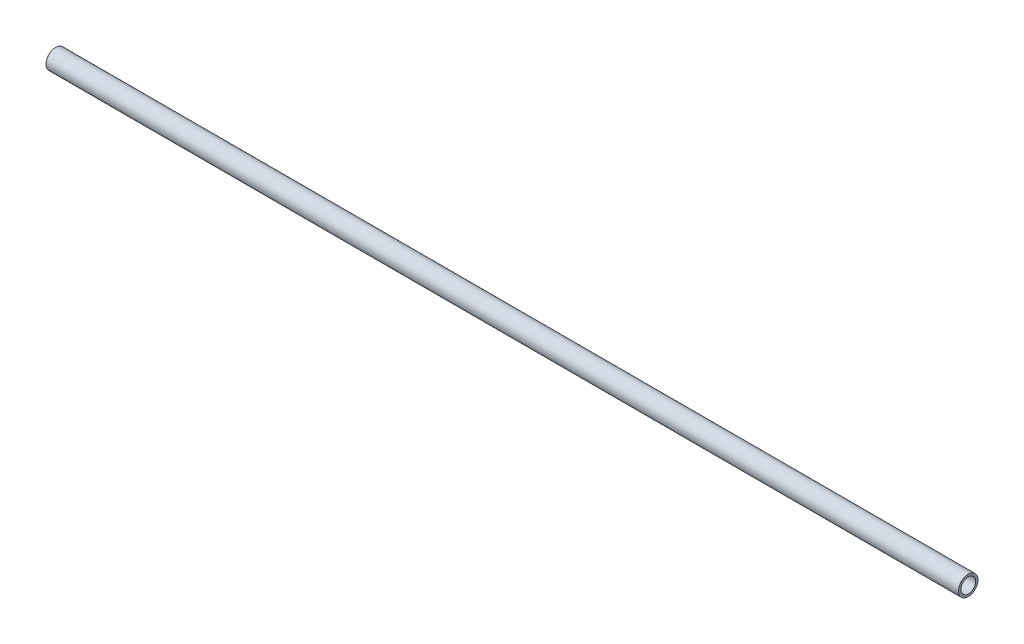
ISO-10303-21;
HEADER;
FILE_DESCRIPTION(('STEP AP214'),'2;1');
FILE_NAME('part.step','',(''),(''),'','','');
FILE_SCHEMA(('AUTOMOTIVE_DESIGN { 1 0 10303 214 1 1 1 1 }'));
ENDSEC;
DATA;
#1=APPLICATION_CONTEXT('core data for automotive mechanical design processes');
#2=APPLICATION_PROTOCOL_DEFINITION('international standard','automotive_design',2000,#1);
#3=PRODUCT_CONTEXT('',#1,'mechanical');
#4=PRODUCT('Part','Part','',(#3));
#5=PRODUCT_RELATED_PRODUCT_CATEGORY('part','',(#4));
#6=PRODUCT_DEFINITION_FORMATION('','',#4);
#7=PRODUCT_DEFINITION_CONTEXT('part definition',#1,'design');
#8=PRODUCT_DEFINITION('design','',#6,#7);
#9=PRODUCT_DEFINITION_SHAPE('','',#8);
#10=(LENGTH_UNIT() NAMED_UNIT(*) SI_UNIT(.MILLI.,.METRE.));
#11=(NAMED_UNIT(*) PLANE_ANGLE_UNIT() SI_UNIT($,.RADIAN.));
#12=(NAMED_UNIT(*) SI_UNIT($,.STERADIAN.) SOLID_ANGLE_UNIT());
#13=UNCERTAINTY_MEASURE_WITH_UNIT(LENGTH_MEASURE(1.E-05),#10,'distance_accuracy_value','');
#14=(GEOMETRIC_REPRESENTATION_CONTEXT(3) GLOBAL_UNCERTAINTY_ASSIGNED_CONTEXT((#13)) GLOBAL_UNIT_ASSIGNED_CONTEXT((#10,
#11,#12)) REPRESENTATION_CONTEXT('',''));
#15=CARTESIAN_POINT('',(0.,0.,0.));
#16=DIRECTION('',(0.,0.,1.));
#17=DIRECTION('',(1.,0.,0.));
#18=AXIS2_PLACEMENT_3D('',#15,#16,#17);
#19=CARTESIAN_POINT('',(1190.,0.,0.));
#20=DIRECTION('',(1.,0.,0.));
#21=DIRECTION('',(0.,0.,-1.));
#22=AXIS2_PLACEMENT_3D('',#19,#20,#21);
#23=PLANE('',#22);
#24=CARTESIAN_POINT('',(1190.,0.,0.));
#25=DIRECTION('',(1.,0.,0.));
#26=DIRECTION('',(0.,0.,-1.));
#27=AXIS2_PLACEMENT_3D('',#24,#25,#26);
#28=CIRCLE('',#27,12.7);
#29=CARTESIAN_POINT('',(1190.,0.,-12.7));
#30=VERTEX_POINT('',#29);
#31=EDGE_CURVE('E10',#30,#30,#28,.T.);
#32=ORIENTED_EDGE('',*,*,#31,.T.);
#33=EDGE_LOOP('',(#32));
#34=FACE_BOUND('',#33,.T.);
#35=CARTESIAN_POINT('',(1190.,0.,0.));
#36=DIRECTION('',(1.,0.,0.));
#37=DIRECTION('',(0.,0.,-1.));
#38=AXIS2_PLACEMENT_3D('',#35,#36,#37);
#39=CIRCLE('',#38,9.652);
#40=CARTESIAN_POINT('',(1190.,0.,-9.652));
#41=VERTEX_POINT('',#40);
#42=EDGE_CURVE('E45',#41,#41,#39,.T.);
#43=ORIENTED_EDGE('',*,*,#42,.F.);
#44=EDGE_LOOP('',(#43));
#45=FACE_BOUND('',#44,.T.);
#46=ADVANCED_FACE('F34',(#34,#45),#23,.T.);
#47=CARTESIAN_POINT('',(0.,0.,0.));
#48=DIRECTION('',(1.,0.,0.));
#49=DIRECTION('',(0.,0.,-1.));
#50=AXIS2_PLACEMENT_3D('',#47,#48,#49);
#51=PLANE('',#50);
#52=CARTESIAN_POINT('',(0.,0.,0.));
#53=DIRECTION('',(1.,0.,0.));
#54=DIRECTION('',(0.,0.,-1.));
#55=AXIS2_PLACEMENT_3D('',#52,#53,#54);
#56=CIRCLE('',#55,12.7);
#57=CARTESIAN_POINT('',(0.,0.,-12.7));
#58=VERTEX_POINT('',#57);
#59=EDGE_CURVE('E38',#58,#58,#56,.T.);
#60=ORIENTED_EDGE('',*,*,#59,.F.);
#61=EDGE_LOOP('',(#60));
#62=FACE_BOUND('',#61,.T.);
#63=CARTESIAN_POINT('',(0.,0.,0.));
#64=DIRECTION('',(1.,0.,0.));
#65=DIRECTION('',(0.,0.,-1.));
#66=AXIS2_PLACEMENT_3D('',#63,#64,#65);
#67=CIRCLE('',#66,9.652);
#68=CARTESIAN_POINT('',(0.,0.,-9.652));
#69=VERTEX_POINT('',#68);
#70=EDGE_CURVE('E47',#69,#69,#67,.T.);
#71=ORIENTED_EDGE('',*,*,#70,.T.);
#72=EDGE_LOOP('',(#71));
#73=FACE_BOUND('',#72,.T.);
#74=ADVANCED_FACE('F57',(#62,#73),#51,.F.);
#75=CARTESIAN_POINT('',(1190.,0.,0.));
#76=DIRECTION('',(-1.,0.,0.));
#77=DIRECTION('',(0.,0.,1.));
#78=AXIS2_PLACEMENT_3D('',#75,#76,#77);
#79=CYLINDRICAL_SURFACE('',#78,12.7);
#80=ORIENTED_EDGE('',*,*,#31,.F.);
#81=EDGE_LOOP('',(#80));
#82=FACE_BOUND('',#81,.T.);
#83=ORIENTED_EDGE('',*,*,#59,.T.);
#84=EDGE_LOOP('',(#83));
#85=FACE_BOUND('',#84,.T.);
#86=ADVANCED_FACE('F36',(#82,#85),#79,.T.);
#87=CARTESIAN_POINT('',(1190.,0.,0.));
#88=DIRECTION('',(-1.,0.,0.));
#89=DIRECTION('',(0.,0.,1.));
#90=AXIS2_PLACEMENT_3D('',#87,#88,#89);
#91=CYLINDRICAL_SURFACE('',#90,9.652);
#92=ORIENTED_EDGE('',*,*,#42,.T.);
#93=EDGE_LOOP('',(#92));
#94=FACE_BOUND('',#93,.T.);
#95=ORIENTED_EDGE('',*,*,#70,.F.);
#96=EDGE_LOOP('',(#95));
#97=FACE_BOUND('',#96,.T.);
#98=ADVANCED_FACE('F53',(#94,#97),#91,.F.);
#99=CLOSED_SHELL('',(#46,#74,#86,#98));
#100=MANIFOLD_SOLID_BREP('B2',#99);
#101=ADVANCED_BREP_SHAPE_REPRESENTATION('',(#18,#100),#14);
#102=SHAPE_DEFINITION_REPRESENTATION(#9,#101);
ENDSEC;
END-ISO-10303-21;
